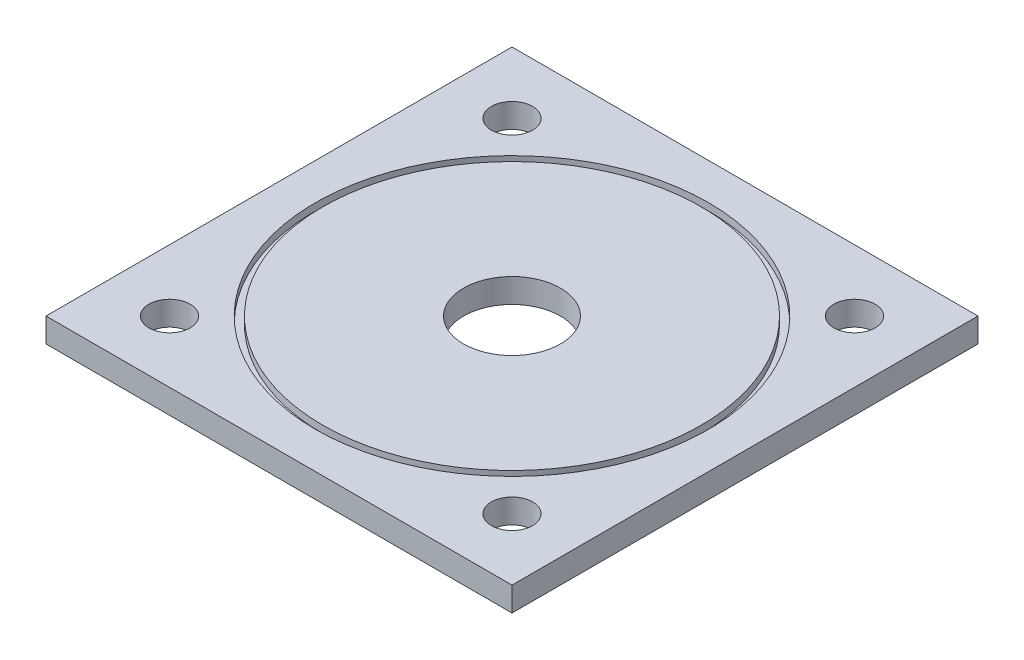
ISO-10303-21;
HEADER;
FILE_DESCRIPTION(('STEP AP214'),'2;1');
FILE_NAME('part.step','',(''),(''),'','','');
FILE_SCHEMA(('AUTOMOTIVE_DESIGN { 1 0 10303 214 1 1 1 1 }'));
ENDSEC;
DATA;
#1=APPLICATION_CONTEXT('core data for automotive mechanical design processes');
#2=APPLICATION_PROTOCOL_DEFINITION('international standard','automotive_design',2000,#1);
#3=PRODUCT_CONTEXT('',#1,'mechanical');
#4=PRODUCT('Part','Part','',(#3));
#5=PRODUCT_RELATED_PRODUCT_CATEGORY('part','',(#4));
#6=PRODUCT_DEFINITION_FORMATION('','',#4);
#7=PRODUCT_DEFINITION_CONTEXT('part definition',#1,'design');
#8=PRODUCT_DEFINITION('design','',#6,#7);
#9=PRODUCT_DEFINITION_SHAPE('','',#8);
#10=(LENGTH_UNIT() NAMED_UNIT(*) SI_UNIT(.MILLI.,.METRE.));
#11=(NAMED_UNIT(*) PLANE_ANGLE_UNIT() SI_UNIT($,.RADIAN.));
#12=(NAMED_UNIT(*) SI_UNIT($,.STERADIAN.) SOLID_ANGLE_UNIT());
#13=UNCERTAINTY_MEASURE_WITH_UNIT(LENGTH_MEASURE(1.E-05),#10,'distance_accuracy_value','');
#14=(GEOMETRIC_REPRESENTATION_CONTEXT(3) GLOBAL_UNCERTAINTY_ASSIGNED_CONTEXT((#13)) GLOBAL_UNIT_ASSIGNED_CONTEXT((#10,
#11,#12)) REPRESENTATION_CONTEXT('',''));
#15=CARTESIAN_POINT('',(0.,0.,0.));
#16=DIRECTION('',(0.,0.,1.));
#17=DIRECTION('',(1.,0.,0.));
#18=AXIS2_PLACEMENT_3D('',#15,#16,#17);
#19=CARTESIAN_POINT('',(0.,0.,0.));
#20=DIRECTION('',(0.,1.,0.));
#21=DIRECTION('',(0.,0.,1.));
#22=AXIS2_PLACEMENT_3D('',#19,#20,#21);
#23=PLANE('',#22);
#24=CARTESIAN_POINT('',(0.,0.,0.));
#25=DIRECTION('',(0.,1.,0.));
#26=DIRECTION('',(0.,0.,1.));
#27=AXIS2_PLACEMENT_3D('',#24,#25,#26);
#28=CIRCLE('',#27,10.);
#29=CARTESIAN_POINT('',(0.,0.,10.));
#30=VERTEX_POINT('',#29);
#31=EDGE_CURVE('E37',#30,#30,#28,.T.);
#32=ORIENTED_EDGE('',*,*,#31,.T.);
#33=EDGE_LOOP('',(#32));
#34=FACE_BOUND('',#33,.T.);
#35=CARTESIAN_POINT('',(0.,0.,0.));
#36=DIRECTION('',(0.,-1.,0.));
#37=DIRECTION('',(0.,0.,-1.));
#38=AXIS2_PLACEMENT_3D('',#35,#36,#37);
#39=CIRCLE('',#38,39.0589171974522);
#40=CARTESIAN_POINT('',(0.,0.,-39.0589171974522));
#41=VERTEX_POINT('',#40);
#42=EDGE_CURVE('E160',#41,#41,#39,.T.);
#43=ORIENTED_EDGE('',*,*,#42,.T.);
#44=EDGE_LOOP('',(#43));
#45=FACE_BOUND('',#44,.T.);
#46=ADVANCED_FACE('F33',(#34,#45),#23,.F.);
#47=CARTESIAN_POINT('',(0.,5.,0.));
#48=DIRECTION('',(0.,1.,0.));
#49=DIRECTION('',(0.,0.,1.));
#50=AXIS2_PLACEMENT_3D('',#47,#48,#49);
#51=PLANE('',#50);
#52=CARTESIAN_POINT('',(0.,5.,0.));
#53=DIRECTION('',(0.,1.,0.));
#54=DIRECTION('',(0.,0.,1.));
#55=AXIS2_PLACEMENT_3D('',#52,#53,#54);
#56=CIRCLE('',#55,10.);
#57=CARTESIAN_POINT('',(0.,5.,10.));
#58=VERTEX_POINT('',#57);
#59=EDGE_CURVE('E138',#58,#58,#56,.T.);
#60=ORIENTED_EDGE('',*,*,#59,.F.);
#61=EDGE_LOOP('',(#60));
#62=FACE_BOUND('',#61,.T.);
#63=CARTESIAN_POINT('',(0.,5.,0.));
#64=DIRECTION('',(0.,1.,0.));
#65=DIRECTION('',(0.,0.,1.));
#66=AXIS2_PLACEMENT_3D('',#63,#64,#65);
#67=CIRCLE('',#66,39.0589171974522);
#68=CARTESIAN_POINT('',(0.,5.,39.0589171974522));
#69=VERTEX_POINT('',#68);
#70=EDGE_CURVE('E148',#69,#69,#67,.T.);
#71=ORIENTED_EDGE('',*,*,#70,.T.);
#72=EDGE_LOOP('',(#71));
#73=FACE_BOUND('',#72,.T.);
#74=ADVANCED_FACE('F188',(#62,#73),#51,.T.);
#75=CARTESIAN_POINT('',(0.,5.,0.));
#76=DIRECTION('',(0.,1.,0.));
#77=DIRECTION('',(0.,0.,1.));
#78=AXIS2_PLACEMENT_3D('',#75,#76,#77);
#79=CIRCLE('',#78,40.5589171974522);
#80=CARTESIAN_POINT('',(0.,5.,40.5589171974522));
#81=VERTEX_POINT('',#80);
#82=EDGE_CURVE('E142',#81,#81,#79,.T.);
#83=ORIENTED_EDGE('',*,*,#82,.F.);
#84=EDGE_LOOP('',(#83));
#85=FACE_BOUND('',#84,.T.);
#86=CARTESIAN_POINT('',(35.3553390593274,5.,35.3553390593274));
#87=DIRECTION('',(0.,1.,0.));
#88=DIRECTION('',(0.,0.,1.));
#89=AXIS2_PLACEMENT_3D('',#86,#87,#88);
#90=CIRCLE('',#89,4.25000000000031);
#91=CARTESIAN_POINT('',(35.3553390593274,5.,39.6053390593277));
#92=VERTEX_POINT('',#91);
#93=EDGE_CURVE('E124',#92,#92,#90,.T.);
#94=ORIENTED_EDGE('',*,*,#93,.F.);
#95=EDGE_LOOP('',(#94));
#96=FACE_BOUND('',#95,.T.);
#97=CARTESIAN_POINT('',(-35.3553390593274,5.,-35.3553390593274));
#98=DIRECTION('',(0.,1.,0.));
#99=DIRECTION('',(0.,0.,1.));
#100=AXIS2_PLACEMENT_3D('',#97,#98,#99);
#101=CIRCLE('',#100,4.25);
#102=CARTESIAN_POINT('',(-35.3553390593274,5.,-31.1053390593274));
#103=VERTEX_POINT('',#102);
#104=EDGE_CURVE('E103',#103,#103,#101,.T.);
#105=ORIENTED_EDGE('',*,*,#104,.F.);
#106=EDGE_LOOP('',(#105));
#107=FACE_BOUND('',#106,.T.);
#108=DIRECTION('',(0.,0.,-1.));
#109=VECTOR('',#108,1.);
#110=CARTESIAN_POINT('',(48.1053390593274,5.,-48.1053390593274));
#111=LINE('',#110,#109);
#112=CARTESIAN_POINT('',(48.1053390593274,5.,48.1053390593274));
#113=VERTEX_POINT('',#112);
#114=CARTESIAN_POINT('',(48.1053390593274,5.,-48.1053390593274));
#115=VERTEX_POINT('',#114);
#116=EDGE_CURVE('E87',#113,#115,#111,.T.);
#117=ORIENTED_EDGE('',*,*,#116,.T.);
#118=DIRECTION('',(-1.,0.,0.));
#119=VECTOR('',#118,1.);
#120=CARTESIAN_POINT('',(-48.1053390593274,5.,-48.1053390593274));
#121=LINE('',#120,#119);
#122=CARTESIAN_POINT('',(-48.1053390593274,5.,-48.1053390593274));
#123=VERTEX_POINT('',#122);
#124=EDGE_CURVE('E81',#115,#123,#121,.T.);
#125=ORIENTED_EDGE('',*,*,#124,.T.);
#126=DIRECTION('',(0.,0.,1.));
#127=VECTOR('',#126,1.);
#128=CARTESIAN_POINT('',(-48.1053390593274,5.,-48.1053390593274));
#129=LINE('',#128,#127);
#130=CARTESIAN_POINT('',(-48.1053390593274,5.,48.1053390593274));
#131=VERTEX_POINT('',#130);
#132=EDGE_CURVE('E85',#123,#131,#129,.T.);
#133=ORIENTED_EDGE('',*,*,#132,.T.);
#134=DIRECTION('',(1.,0.,0.));
#135=VECTOR('',#134,1.);
#136=CARTESIAN_POINT('',(-48.1053390593274,5.,48.1053390593274));
#137=LINE('',#136,#135);
#138=EDGE_CURVE('E51',#131,#113,#137,.T.);
#139=ORIENTED_EDGE('',*,*,#138,.T.);
#140=EDGE_LOOP('',(#117,#125,#133,#139));
#141=FACE_BOUND('',#140,.T.);
#142=CARTESIAN_POINT('',(35.3553390593274,5.,-35.3553390593274));
#143=DIRECTION('',(0.,1.,0.));
#144=DIRECTION('',(0.,0.,1.));
#145=AXIS2_PLACEMENT_3D('',#142,#143,#144);
#146=CIRCLE('',#145,4.25000000000015);
#147=CARTESIAN_POINT('',(35.3553390593274,5.,-31.1053390593272));
#148=VERTEX_POINT('',#147);
#149=EDGE_CURVE('E118',#148,#148,#146,.T.);
#150=ORIENTED_EDGE('',*,*,#149,.F.);
#151=EDGE_LOOP('',(#150));
#152=FACE_BOUND('',#151,.T.);
#153=CARTESIAN_POINT('',(-35.3553390593274,5.,35.3553390593274));
#154=DIRECTION('',(0.,1.,0.));
#155=DIRECTION('',(0.,0.,1.));
#156=AXIS2_PLACEMENT_3D('',#153,#154,#155);
#157=CIRCLE('',#156,4.25000000000047);
#158=CARTESIAN_POINT('',(-35.3553390593274,5.,39.6053390593279));
#159=VERTEX_POINT('',#158);
#160=EDGE_CURVE('E130',#159,#159,#157,.T.);
#161=ORIENTED_EDGE('',*,*,#160,.F.);
#162=EDGE_LOOP('',(#161));
#163=FACE_BOUND('',#162,.T.);
#164=ADVANCED_FACE('F82',(#85,#96,#107,#141,#152,#163),#51,.T.);
#165=CARTESIAN_POINT('',(0.,0.,0.));
#166=DIRECTION('',(0.,-1.,0.));
#167=DIRECTION('',(0.,0.,-1.));
#168=AXIS2_PLACEMENT_3D('',#165,#166,#167);
#169=CIRCLE('',#168,40.5589171974522);
#170=CARTESIAN_POINT('',(0.,0.,-40.5589171974522));
#171=VERTEX_POINT('',#170);
#172=EDGE_CURVE('E154',#171,#171,#169,.T.);
#173=ORIENTED_EDGE('',*,*,#172,.F.);
#174=EDGE_LOOP('',(#173));
#175=FACE_BOUND('',#174,.T.);
#176=DIRECTION('',(0.,0.,-1.));
#177=VECTOR('',#176,1.);
#178=CARTESIAN_POINT('',(48.1053390593274,0.,-48.1053390593274));
#179=LINE('',#178,#177);
#180=CARTESIAN_POINT('',(48.1053390593274,0.,48.1053390593274));
#181=VERTEX_POINT('',#180);
#182=CARTESIAN_POINT('',(48.1053390593274,0.,-48.1053390593274));
#183=VERTEX_POINT('',#182);
#184=EDGE_CURVE('E100',#181,#183,#179,.T.);
#185=ORIENTED_EDGE('',*,*,#184,.F.);
#186=DIRECTION('',(1.,0.,0.));
#187=VECTOR('',#186,1.);
#188=CARTESIAN_POINT('',(-48.1053390593274,0.,48.1053390593274));
#189=LINE('',#188,#187);
#190=CARTESIAN_POINT('',(-48.1053390593274,0.,48.1053390593274));
#191=VERTEX_POINT('',#190);
#192=EDGE_CURVE('E74',#191,#181,#189,.T.);
#193=ORIENTED_EDGE('',*,*,#192,.F.);
#194=DIRECTION('',(0.,0.,1.));
#195=VECTOR('',#194,1.);
#196=CARTESIAN_POINT('',(-48.1053390593274,0.,-48.1053390593274));
#197=LINE('',#196,#195);
#198=CARTESIAN_POINT('',(-48.1053390593274,0.,-48.1053390593274));
#199=VERTEX_POINT('',#198);
#200=EDGE_CURVE('E68',#199,#191,#197,.T.);
#201=ORIENTED_EDGE('',*,*,#200,.F.);
#202=DIRECTION('',(-1.,0.,0.));
#203=VECTOR('',#202,1.);
#204=CARTESIAN_POINT('',(-48.1053390593274,0.,-48.1053390593274));
#205=LINE('',#204,#203);
#206=EDGE_CURVE('E91',#183,#199,#205,.T.);
#207=ORIENTED_EDGE('',*,*,#206,.F.);
#208=EDGE_LOOP('',(#185,#193,#201,#207));
#209=FACE_BOUND('',#208,.T.);
#210=CARTESIAN_POINT('',(-35.3553390593274,0.,-35.3553390593274));
#211=DIRECTION('',(0.,1.,0.));
#212=DIRECTION('',(0.,0.,1.));
#213=AXIS2_PLACEMENT_3D('',#210,#211,#212);
#214=CIRCLE('',#213,4.25);
#215=CARTESIAN_POINT('',(-35.3553390593274,0.,-31.1053390593274));
#216=VERTEX_POINT('',#215);
#217=EDGE_CURVE('E115',#216,#216,#214,.T.);
#218=ORIENTED_EDGE('',*,*,#217,.T.);
#219=EDGE_LOOP('',(#218));
#220=FACE_BOUND('',#219,.T.);
#221=CARTESIAN_POINT('',(35.3553390593274,0.,-35.3553390593274));
#222=DIRECTION('',(0.,1.,0.));
#223=DIRECTION('',(0.,0.,1.));
#224=AXIS2_PLACEMENT_3D('',#221,#222,#223);
#225=CIRCLE('',#224,4.25000000000015);
#226=CARTESIAN_POINT('',(35.3553390593274,0.,-31.1053390593272));
#227=VERTEX_POINT('',#226);
#228=EDGE_CURVE('E121',#227,#227,#225,.T.);
#229=ORIENTED_EDGE('',*,*,#228,.T.);
#230=EDGE_LOOP('',(#229));
#231=FACE_BOUND('',#230,.T.);
#232=CARTESIAN_POINT('',(35.3553390593274,0.,35.3553390593274));
#233=DIRECTION('',(0.,1.,0.));
#234=DIRECTION('',(0.,0.,1.));
#235=AXIS2_PLACEMENT_3D('',#232,#233,#234);
#236=CIRCLE('',#235,4.25000000000031);
#237=CARTESIAN_POINT('',(35.3553390593274,0.,39.6053390593277));
#238=VERTEX_POINT('',#237);
#239=EDGE_CURVE('E127',#238,#238,#236,.T.);
#240=ORIENTED_EDGE('',*,*,#239,.T.);
#241=EDGE_LOOP('',(#240));
#242=FACE_BOUND('',#241,.T.);
#243=CARTESIAN_POINT('',(-35.3553390593274,0.,35.3553390593274));
#244=DIRECTION('',(0.,1.,0.));
#245=DIRECTION('',(0.,0.,1.));
#246=AXIS2_PLACEMENT_3D('',#243,#244,#245);
#247=CIRCLE('',#246,4.25000000000047);
#248=CARTESIAN_POINT('',(-35.3553390593274,0.,39.6053390593279));
#249=VERTEX_POINT('',#248);
#250=EDGE_CURVE('E133',#249,#249,#247,.T.);
#251=ORIENTED_EDGE('',*,*,#250,.T.);
#252=EDGE_LOOP('',(#251));
#253=FACE_BOUND('',#252,.T.);
#254=ADVANCED_FACE('F111',(#175,#209,#220,#231,#242,#253),#23,.F.);
#255=CARTESIAN_POINT('',(48.1053390593274,5.,-48.1053390593274));
#256=DIRECTION('',(-1.,0.,0.));
#257=DIRECTION('',(0.,0.,1.));
#258=AXIS2_PLACEMENT_3D('',#255,#256,#257);
#259=PLANE('',#258);
#260=ORIENTED_EDGE('',*,*,#184,.T.);
#261=DIRECTION('',(0.,-1.,0.));
#262=VECTOR('',#261,1.);
#263=CARTESIAN_POINT('',(48.1053390593274,5.,-48.1053390593274));
#264=LINE('',#263,#262);
#265=EDGE_CURVE('E11',#115,#183,#264,.T.);
#266=ORIENTED_EDGE('',*,*,#265,.F.);
#267=ORIENTED_EDGE('',*,*,#116,.F.);
#268=DIRECTION('',(0.,-1.,0.));
#269=VECTOR('',#268,1.);
#270=CARTESIAN_POINT('',(48.1053390593274,5.,48.1053390593274));
#271=LINE('',#270,#269);
#272=EDGE_CURVE('E96',#113,#181,#271,.T.);
#273=ORIENTED_EDGE('',*,*,#272,.T.);
#274=EDGE_LOOP('',(#260,#266,#267,#273));
#275=FACE_BOUND('',#274,.T.);
#276=ADVANCED_FACE('F35',(#275),#259,.F.);
#277=CARTESIAN_POINT('',(-48.1053390593274,5.,-48.1053390593274));
#278=DIRECTION('',(0.,0.,1.));
#279=DIRECTION('',(1.,0.,0.));
#280=AXIS2_PLACEMENT_3D('',#277,#278,#279);
#281=PLANE('',#280);
#282=ORIENTED_EDGE('',*,*,#206,.T.);
#283=DIRECTION('',(0.,-1.,0.));
#284=VECTOR('',#283,1.);
#285=CARTESIAN_POINT('',(-48.1053390593274,5.,-48.1053390593274));
#286=LINE('',#285,#284);
#287=EDGE_CURVE('E43',#123,#199,#286,.T.);
#288=ORIENTED_EDGE('',*,*,#287,.F.);
#289=ORIENTED_EDGE('',*,*,#124,.F.);
#290=ORIENTED_EDGE('',*,*,#265,.T.);
#291=EDGE_LOOP('',(#282,#288,#289,#290));
#292=FACE_BOUND('',#291,.T.);
#293=ADVANCED_FACE('F90',(#292),#281,.F.);
#294=CARTESIAN_POINT('',(-48.1053390593274,5.,-48.1053390593274));
#295=DIRECTION('',(1.,0.,0.));
#296=DIRECTION('',(0.,0.,-1.));
#297=AXIS2_PLACEMENT_3D('',#294,#295,#296);
#298=PLANE('',#297);
#299=ORIENTED_EDGE('',*,*,#200,.T.);
#300=DIRECTION('',(0.,-1.,0.));
#301=VECTOR('',#300,1.);
#302=CARTESIAN_POINT('',(-48.1053390593274,5.,48.1053390593274));
#303=LINE('',#302,#301);
#304=EDGE_CURVE('E92',#131,#191,#303,.T.);
#305=ORIENTED_EDGE('',*,*,#304,.F.);
#306=ORIENTED_EDGE('',*,*,#132,.F.);
#307=ORIENTED_EDGE('',*,*,#287,.T.);
#308=EDGE_LOOP('',(#299,#305,#306,#307));
#309=FACE_BOUND('',#308,.T.);
#310=ADVANCED_FACE('F94',(#309),#298,.F.);
#311=CARTESIAN_POINT('',(-48.1053390593274,5.,48.1053390593274));
#312=DIRECTION('',(0.,0.,-1.));
#313=DIRECTION('',(-1.,0.,0.));
#314=AXIS2_PLACEMENT_3D('',#311,#312,#313);
#315=PLANE('',#314);
#316=ORIENTED_EDGE('',*,*,#192,.T.);
#317=ORIENTED_EDGE('',*,*,#272,.F.);
#318=ORIENTED_EDGE('',*,*,#138,.F.);
#319=ORIENTED_EDGE('',*,*,#304,.T.);
#320=EDGE_LOOP('',(#316,#317,#318,#319));
#321=FACE_BOUND('',#320,.T.);
#322=ADVANCED_FACE('F108',(#321),#315,.F.);
#323=CARTESIAN_POINT('',(-35.3553390593274,5.,-35.3553390593274));
#324=DIRECTION('',(0.,-1.,0.));
#325=DIRECTION('',(0.,0.,-1.));
#326=AXIS2_PLACEMENT_3D('',#323,#324,#325);
#327=CYLINDRICAL_SURFACE('',#326,4.25);
#328=ORIENTED_EDGE('',*,*,#104,.T.);
#329=EDGE_LOOP('',(#328));
#330=FACE_BOUND('',#329,.T.);
#331=ORIENTED_EDGE('',*,*,#217,.F.);
#332=EDGE_LOOP('',(#331));
#333=FACE_BOUND('',#332,.T.);
#334=ADVANCED_FACE('F233',(#330,#333),#327,.F.);
#335=CARTESIAN_POINT('',(35.3553390593274,5.,-35.3553390593274));
#336=DIRECTION('',(0.,-1.,0.));
#337=DIRECTION('',(0.,0.,-1.));
#338=AXIS2_PLACEMENT_3D('',#335,#336,#337);
#339=CYLINDRICAL_SURFACE('',#338,4.25000000000015);
#340=ORIENTED_EDGE('',*,*,#149,.T.);
#341=EDGE_LOOP('',(#340));
#342=FACE_BOUND('',#341,.T.);
#343=ORIENTED_EDGE('',*,*,#228,.F.);
#344=EDGE_LOOP('',(#343));
#345=FACE_BOUND('',#344,.T.);
#346=ADVANCED_FACE('F229',(#342,#345),#339,.F.);
#347=CARTESIAN_POINT('',(35.3553390593274,5.,35.3553390593274));
#348=DIRECTION('',(0.,-1.,0.));
#349=DIRECTION('',(0.,0.,-1.));
#350=AXIS2_PLACEMENT_3D('',#347,#348,#349);
#351=CYLINDRICAL_SURFACE('',#350,4.25000000000031);
#352=ORIENTED_EDGE('',*,*,#93,.T.);
#353=EDGE_LOOP('',(#352));
#354=FACE_BOUND('',#353,.T.);
#355=ORIENTED_EDGE('',*,*,#239,.F.);
#356=EDGE_LOOP('',(#355));
#357=FACE_BOUND('',#356,.T.);
#358=ADVANCED_FACE('F225',(#354,#357),#351,.F.);
#359=CARTESIAN_POINT('',(-35.3553390593274,5.,35.3553390593274));
#360=DIRECTION('',(0.,-1.,0.));
#361=DIRECTION('',(0.,0.,-1.));
#362=AXIS2_PLACEMENT_3D('',#359,#360,#361);
#363=CYLINDRICAL_SURFACE('',#362,4.25000000000047);
#364=ORIENTED_EDGE('',*,*,#160,.T.);
#365=EDGE_LOOP('',(#364));
#366=FACE_BOUND('',#365,.T.);
#367=ORIENTED_EDGE('',*,*,#250,.F.);
#368=EDGE_LOOP('',(#367));
#369=FACE_BOUND('',#368,.T.);
#370=ADVANCED_FACE('F221',(#366,#369),#363,.F.);
#371=CARTESIAN_POINT('',(0.,-17.5,0.));
#372=DIRECTION('',(0.,1.,0.));
#373=DIRECTION('',(0.,0.,1.));
#374=AXIS2_PLACEMENT_3D('',#371,#372,#373);
#375=CYLINDRICAL_SURFACE('',#374,10.);
#376=CARTESIAN_POINT('',(0.,5.,10.));
#377=CARTESIAN_POINT('',(0.,4.94791666666666,10.));
#378=CARTESIAN_POINT('',(0.,4.89583333333333,10.));
#379=CARTESIAN_POINT('',(0.,4.79166666666666,10.));
#380=CARTESIAN_POINT('',(0.,4.73958333333333,10.));
#381=CARTESIAN_POINT('',(0.,4.63541666666666,10.));
#382=CARTESIAN_POINT('',(0.,4.58333333333333,10.));
#383=CARTESIAN_POINT('',(0.,4.47916666666666,10.));
#384=CARTESIAN_POINT('',(0.,4.42708333333333,10.));
#385=CARTESIAN_POINT('',(0.,4.32291666666666,10.));
#386=CARTESIAN_POINT('',(0.,4.27083333333333,10.));
#387=CARTESIAN_POINT('',(0.,4.16666666666666,10.));
#388=CARTESIAN_POINT('',(0.,4.11458333333333,10.));
#389=CARTESIAN_POINT('',(0.,4.01041666666666,10.));
#390=CARTESIAN_POINT('',(0.,3.95833333333333,10.));
#391=CARTESIAN_POINT('',(0.,3.85416666666666,10.));
#392=CARTESIAN_POINT('',(0.,3.80208333333333,10.));
#393=CARTESIAN_POINT('',(0.,3.69791666666666,10.));
#394=CARTESIAN_POINT('',(0.,3.64583333333333,10.));
#395=CARTESIAN_POINT('',(0.,3.54166666666667,10.));
#396=CARTESIAN_POINT('',(0.,3.48958333333333,10.));
#397=CARTESIAN_POINT('',(0.,3.38541666666667,10.));
#398=CARTESIAN_POINT('',(0.,3.33333333333333,10.));
#399=CARTESIAN_POINT('',(0.,3.22916666666667,10.));
#400=CARTESIAN_POINT('',(0.,3.17708333333333,10.));
#401=CARTESIAN_POINT('',(0.,3.07291666666667,10.));
#402=CARTESIAN_POINT('',(0.,3.02083333333333,10.));
#403=CARTESIAN_POINT('',(0.,2.91666666666667,10.));
#404=CARTESIAN_POINT('',(0.,2.86458333333333,10.));
#405=CARTESIAN_POINT('',(0.,2.76041666666667,10.));
#406=CARTESIAN_POINT('',(0.,2.70833333333333,10.));
#407=CARTESIAN_POINT('',(0.,2.60416666666667,10.));
#408=CARTESIAN_POINT('',(0.,2.55208333333333,10.));
#409=CARTESIAN_POINT('',(0.,2.44791666666667,10.));
#410=CARTESIAN_POINT('',(0.,2.39583333333333,10.));
#411=CARTESIAN_POINT('',(0.,2.29166666666667,10.));
#412=CARTESIAN_POINT('',(0.,2.23958333333333,10.));
#413=CARTESIAN_POINT('',(0.,2.13541666666667,10.));
#414=CARTESIAN_POINT('',(0.,2.08333333333333,10.));
#415=CARTESIAN_POINT('',(0.,1.97916666666667,10.));
#416=CARTESIAN_POINT('',(0.,1.92708333333333,10.));
#417=CARTESIAN_POINT('',(0.,1.82291666666666,10.));
#418=CARTESIAN_POINT('',(0.,1.77083333333333,10.));
#419=CARTESIAN_POINT('',(0.,1.66666666666666,10.));
#420=CARTESIAN_POINT('',(0.,1.61458333333333,10.));
#421=CARTESIAN_POINT('',(0.,1.51041666666666,10.));
#422=CARTESIAN_POINT('',(0.,1.45833333333333,10.));
#423=CARTESIAN_POINT('',(0.,1.35416666666667,10.));
#424=CARTESIAN_POINT('',(0.,1.30208333333333,10.));
#425=CARTESIAN_POINT('',(0.,1.19791666666667,10.));
#426=CARTESIAN_POINT('',(0.,1.14583333333333,10.));
#427=CARTESIAN_POINT('',(0.,1.04166666666667,10.));
#428=CARTESIAN_POINT('',(0.,0.989583333333333,10.));
#429=CARTESIAN_POINT('',(0.,0.885416666666668,10.));
#430=CARTESIAN_POINT('',(0.,0.833333333333334,10.));
#431=CARTESIAN_POINT('',(0.,0.729166666666667,10.));
#432=CARTESIAN_POINT('',(0.,0.677083333333334,10.));
#433=CARTESIAN_POINT('',(0.,0.572916666666667,10.));
#434=CARTESIAN_POINT('',(0.,0.520833333333334,10.));
#435=CARTESIAN_POINT('',(0.,0.416666666666667,10.));
#436=CARTESIAN_POINT('',(0.,0.364583333333334,10.));
#437=CARTESIAN_POINT('',(0.,0.260416666666667,10.));
#438=CARTESIAN_POINT('',(0.,0.208333333333333,10.));
#439=CARTESIAN_POINT('',(0.,0.104166666666667,10.));
#440=CARTESIAN_POINT('',(0.,0.0520833333333334,10.));
#441=CARTESIAN_POINT('',(0.,0.,10.));
#442=B_SPLINE_CURVE_WITH_KNOTS('',3,(#376,#377,#378,#379,#380,#381,#382,#383,#384,#385,#386,
#387,#388,#389,#390,#391,#392,#393,#394,#395,#396,#397,#398,#399,#400,#401,#402,#403,#404,#405,
#406,#407,#408,#409,#410,#411,#412,#413,#414,#415,#416,#417,#418,#419,#420,#421,#422,#423,#424,
#425,#426,#427,#428,#429,#430,#431,#432,#433,#434,#435,#436,#437,#438,#439,#440,#441),
.UNSPECIFIED.,.F.,.F.,(4,2,2,2,2,2,2,2,2,2,2,2,2,2,2,2,2,2,2,2,2,2,2,2,2,2,2,2,2,2,2,2,4),(0.,
0.15625,0.3125,0.46875,0.625000000000001,0.781250000000001,0.937500000000001,1.09375,1.25,
1.40625,1.5625,1.71875,1.875,2.03125,2.1875,2.34375,2.5,2.65625,2.8125,2.96875,3.125,3.28125,
3.4375,3.59375,3.75,3.90625,4.0625,4.21875,4.375,4.53125,4.6875,4.84375,5.),.UNSPECIFIED.);
#443=EDGE_CURVE('BSEAM217',#58,#30,#442,.T.);
#444=ORIENTED_EDGE('',*,*,#59,.T.);
#445=ORIENTED_EDGE('',*,*,#31,.F.);
#446=ORIENTED_EDGE('',*,*,#443,.T.);
#447=ORIENTED_EDGE('',*,*,#443,.F.);
#448=EDGE_LOOP('',(#444,#446,#445,#447));
#449=FACE_BOUND('',#448,.T.);
#450=ADVANCED_FACE('F217',(#449),#375,.F.);
#451=CARTESIAN_POINT('',(0.,3.5,0.));
#452=DIRECTION('',(0.,1.,0.));
#453=DIRECTION('',(0.,0.,1.));
#454=AXIS2_PLACEMENT_3D('',#451,#452,#453);
#455=CYLINDRICAL_SURFACE('',#454,40.5589171974522);
#456=CARTESIAN_POINT('',(0.,3.5,0.));
#457=DIRECTION('',(0.,1.,0.));
#458=DIRECTION('',(0.,0.,1.));
#459=AXIS2_PLACEMENT_3D('',#456,#457,#458);
#460=CIRCLE('',#459,40.5589171974522);
#461=CARTESIAN_POINT('',(0.,3.5,40.5589171974522));
#462=VERTEX_POINT('',#461);
#463=EDGE_CURVE('E141',#462,#462,#460,.T.);
#464=ORIENTED_EDGE('',*,*,#463,.F.);
#465=EDGE_LOOP('',(#464));
#466=FACE_BOUND('',#465,.T.);
#467=ORIENTED_EDGE('',*,*,#82,.T.);
#468=EDGE_LOOP('',(#467));
#469=FACE_BOUND('',#468,.T.);
#470=ADVANCED_FACE('F213',(#466,#469),#455,.F.);
#471=CARTESIAN_POINT('',(0.,3.5,0.));
#472=DIRECTION('',(0.,1.,0.));
#473=DIRECTION('',(0.,0.,1.));
#474=AXIS2_PLACEMENT_3D('',#471,#472,#473);
#475=PLANE('',#474);
#476=CARTESIAN_POINT('',(0.,3.5,0.));
#477=DIRECTION('',(0.,1.,0.));
#478=DIRECTION('',(0.,0.,1.));
#479=AXIS2_PLACEMENT_3D('',#476,#477,#478);
#480=CIRCLE('',#479,39.0589171974522);
#481=CARTESIAN_POINT('',(0.,3.5,39.0589171974522));
#482=VERTEX_POINT('',#481);
#483=EDGE_CURVE('E145',#482,#482,#480,.T.);
#484=ORIENTED_EDGE('',*,*,#483,.F.);
#485=EDGE_LOOP('',(#484));
#486=FACE_BOUND('',#485,.T.);
#487=ORIENTED_EDGE('',*,*,#463,.T.);
#488=EDGE_LOOP('',(#487));
#489=FACE_BOUND('',#488,.T.);
#490=ADVANCED_FACE('F209',(#486,#489),#475,.T.);
#491=CARTESIAN_POINT('',(0.,3.5,0.));
#492=DIRECTION('',(0.,1.,0.));
#493=DIRECTION('',(0.,0.,1.));
#494=AXIS2_PLACEMENT_3D('',#491,#492,#493);
#495=CYLINDRICAL_SURFACE('',#494,39.0589171974522);
#496=ORIENTED_EDGE('',*,*,#483,.T.);
#497=EDGE_LOOP('',(#496));
#498=FACE_BOUND('',#497,.T.);
#499=ORIENTED_EDGE('',*,*,#70,.F.);
#500=EDGE_LOOP('',(#499));
#501=FACE_BOUND('',#500,.T.);
#502=ADVANCED_FACE('F178',(#498,#501),#495,.T.);
#503=CARTESIAN_POINT('',(0.,1.5,0.));
#504=DIRECTION('',(0.,-1.,0.));
#505=DIRECTION('',(0.,0.,-1.));
#506=AXIS2_PLACEMENT_3D('',#503,#504,#505);
#507=CYLINDRICAL_SURFACE('',#506,40.5589171974522);
#508=CARTESIAN_POINT('',(0.,1.5,0.));
#509=DIRECTION('',(0.,-1.,0.));
#510=DIRECTION('',(0.,0.,-1.));
#511=AXIS2_PLACEMENT_3D('',#508,#509,#510);
#512=CIRCLE('',#511,40.5589171974522);
#513=CARTESIAN_POINT('',(0.,1.5,-40.5589171974522));
#514=VERTEX_POINT('',#513);
#515=EDGE_CURVE('E151',#514,#514,#512,.T.);
#516=ORIENTED_EDGE('',*,*,#515,.F.);
#517=EDGE_LOOP('',(#516));
#518=FACE_BOUND('',#517,.T.);
#519=ORIENTED_EDGE('',*,*,#172,.T.);
#520=EDGE_LOOP('',(#519));
#521=FACE_BOUND('',#520,.T.);
#522=ADVANCED_FACE('F172',(#518,#521),#507,.F.);
#523=CARTESIAN_POINT('',(0.,1.5,0.));
#524=DIRECTION('',(0.,-1.,0.));
#525=DIRECTION('',(0.,0.,-1.));
#526=AXIS2_PLACEMENT_3D('',#523,#524,#525);
#527=PLANE('',#526);
#528=CARTESIAN_POINT('',(0.,1.5,0.));
#529=DIRECTION('',(0.,-1.,0.));
#530=DIRECTION('',(0.,0.,-1.));
#531=AXIS2_PLACEMENT_3D('',#528,#529,#530);
#532=CIRCLE('',#531,39.0589171974522);
#533=CARTESIAN_POINT('',(0.,1.5,-39.0589171974522));
#534=VERTEX_POINT('',#533);
#535=EDGE_CURVE('E157',#534,#534,#532,.T.);
#536=ORIENTED_EDGE('',*,*,#535,.F.);
#537=EDGE_LOOP('',(#536));
#538=FACE_BOUND('',#537,.T.);
#539=ORIENTED_EDGE('',*,*,#515,.T.);
#540=EDGE_LOOP('',(#539));
#541=FACE_BOUND('',#540,.T.);
#542=ADVANCED_FACE('F169',(#538,#541),#527,.T.);
#543=CARTESIAN_POINT('',(0.,1.5,0.));
#544=DIRECTION('',(0.,-1.,0.));
#545=DIRECTION('',(0.,0.,-1.));
#546=AXIS2_PLACEMENT_3D('',#543,#544,#545);
#547=CYLINDRICAL_SURFACE('',#546,39.0589171974522);
#548=ORIENTED_EDGE('',*,*,#535,.T.);
#549=EDGE_LOOP('',(#548));
#550=FACE_BOUND('',#549,.T.);
#551=ORIENTED_EDGE('',*,*,#42,.F.);
#552=EDGE_LOOP('',(#551));
#553=FACE_BOUND('',#552,.T.);
#554=ADVANCED_FACE('F166',(#550,#553),#547,.T.);
#555=CLOSED_SHELL('',(#46,#74,#164,#254,#276,#293,#310,#322,#334,#346,#358,#370,#450,#470,#490,
#502,#522,#542,#554));
#556=MANIFOLD_SOLID_BREP('B2',#555);
#557=ADVANCED_BREP_SHAPE_REPRESENTATION('',(#18,#556),#14);
#558=SHAPE_DEFINITION_REPRESENTATION(#9,#557);
ENDSEC;
END-ISO-10303-21;
